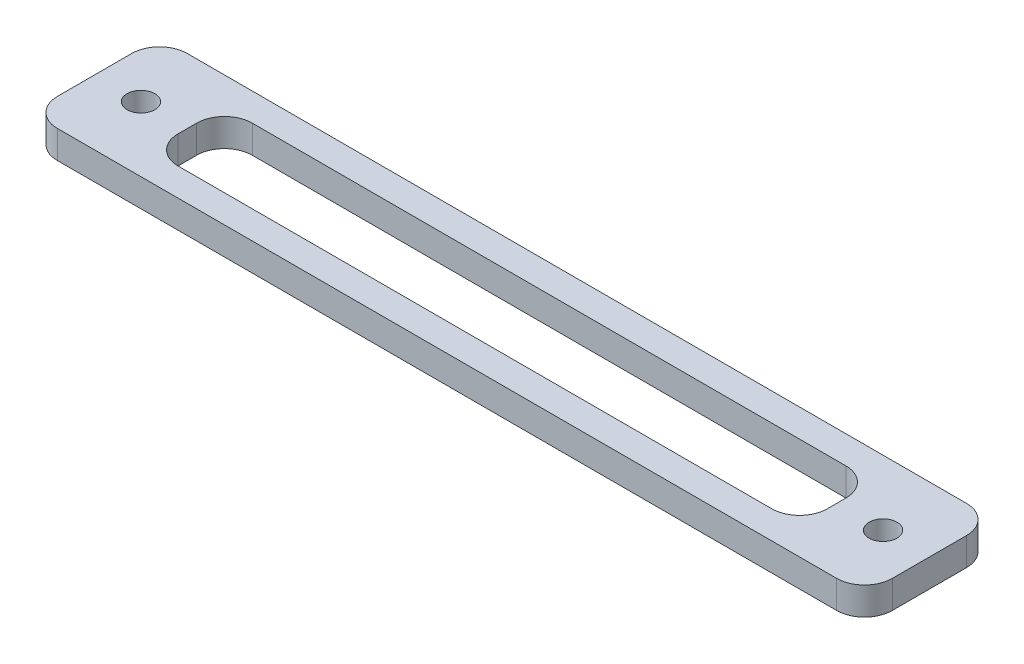
ISO-10303-21;
HEADER;
FILE_DESCRIPTION(('STEP AP214'),'2;1');
FILE_NAME('part.step','',(''),(''),'','','');
FILE_SCHEMA(('AUTOMOTIVE_DESIGN { 1 0 10303 214 1 1 1 1 }'));
ENDSEC;
DATA;
#1=APPLICATION_CONTEXT('core data for automotive mechanical design processes');
#2=APPLICATION_PROTOCOL_DEFINITION('international standard','automotive_design',2000,#1);
#3=PRODUCT_CONTEXT('',#1,'mechanical');
#4=PRODUCT('Part','Part','',(#3));
#5=PRODUCT_RELATED_PRODUCT_CATEGORY('part','',(#4));
#6=PRODUCT_DEFINITION_FORMATION('','',#4);
#7=PRODUCT_DEFINITION_CONTEXT('part definition',#1,'design');
#8=PRODUCT_DEFINITION('design','',#6,#7);
#9=PRODUCT_DEFINITION_SHAPE('','',#8);
#10=(LENGTH_UNIT() NAMED_UNIT(*) SI_UNIT(.MILLI.,.METRE.));
#11=(NAMED_UNIT(*) PLANE_ANGLE_UNIT() SI_UNIT($,.RADIAN.));
#12=(NAMED_UNIT(*) SI_UNIT($,.STERADIAN.) SOLID_ANGLE_UNIT());
#13=UNCERTAINTY_MEASURE_WITH_UNIT(LENGTH_MEASURE(1.E-05),#10,'distance_accuracy_value','');
#14=(GEOMETRIC_REPRESENTATION_CONTEXT(3) GLOBAL_UNCERTAINTY_ASSIGNED_CONTEXT((#13)) GLOBAL_UNIT_ASSIGNED_CONTEXT((#10,
#11,#12)) REPRESENTATION_CONTEXT('',''));
#15=CARTESIAN_POINT('',(0.,0.,0.));
#16=DIRECTION('',(0.,0.,1.));
#17=DIRECTION('',(1.,0.,0.));
#18=AXIS2_PLACEMENT_3D('',#15,#16,#17);
#19=CARTESIAN_POINT('',(0.,3.,0.));
#20=DIRECTION('',(0.,-1.,0.));
#21=DIRECTION('',(0.,0.,-1.));
#22=AXIS2_PLACEMENT_3D('',#19,#20,#21);
#23=PLANE('',#22);
#24=DIRECTION('',(0.,0.,1.));
#25=VECTOR('',#24,1.);
#26=CARTESIAN_POINT('',(-45.,3.,7.));
#27=LINE('',#26,#25);
#28=CARTESIAN_POINT('',(-45.,3.,-4.));
#29=VERTEX_POINT('',#28);
#30=CARTESIAN_POINT('',(-45.,3.,4.));
#31=VERTEX_POINT('',#30);
#32=EDGE_CURVE('E194',#29,#31,#27,.T.);
#33=ORIENTED_EDGE('',*,*,#32,.T.);
#34=CARTESIAN_POINT('',(-42.,3.,4.));
#35=DIRECTION('',(0.,-1.,0.));
#36=DIRECTION('',(0.,0.,-1.));
#37=AXIS2_PLACEMENT_3D('',#34,#35,#36);
#38=CIRCLE('',#37,3.);
#39=CARTESIAN_POINT('',(-42.,3.,7.));
#40=VERTEX_POINT('',#39);
#41=EDGE_CURVE('E253',#31,#40,#38,.F.);
#42=ORIENTED_EDGE('',*,*,#41,.T.);
#43=DIRECTION('',(1.,0.,0.));
#44=VECTOR('',#43,1.);
#45=CARTESIAN_POINT('',(-45.,3.,7.));
#46=LINE('',#45,#44);
#47=CARTESIAN_POINT('',(42.,3.,7.));
#48=VERTEX_POINT('',#47);
#49=EDGE_CURVE('E187',#40,#48,#46,.T.);
#50=ORIENTED_EDGE('',*,*,#49,.T.);
#51=CARTESIAN_POINT('',(42.,3.,4.));
#52=DIRECTION('',(0.,-1.,0.));
#53=DIRECTION('',(0.,0.,-1.));
#54=AXIS2_PLACEMENT_3D('',#51,#52,#53);
#55=CIRCLE('',#54,3.);
#56=CARTESIAN_POINT('',(45.,3.,4.));
#57=VERTEX_POINT('',#56);
#58=EDGE_CURVE('E247',#48,#57,#55,.F.);
#59=ORIENTED_EDGE('',*,*,#58,.T.);
#60=DIRECTION('',(0.,0.,-1.));
#61=VECTOR('',#60,1.);
#62=CARTESIAN_POINT('',(45.,3.,7.));
#63=LINE('',#62,#61);
#64=CARTESIAN_POINT('',(45.,3.,-4.));
#65=VERTEX_POINT('',#64);
#66=EDGE_CURVE('E327',#57,#65,#63,.T.);
#67=ORIENTED_EDGE('',*,*,#66,.T.);
#68=CARTESIAN_POINT('',(42.,3.,-4.));
#69=DIRECTION('',(0.,-1.,0.));
#70=DIRECTION('',(0.,0.,-1.));
#71=AXIS2_PLACEMENT_3D('',#68,#69,#70);
#72=CIRCLE('',#71,3.);
#73=CARTESIAN_POINT('',(42.,3.,-7.));
#74=VERTEX_POINT('',#73);
#75=EDGE_CURVE('E66',#65,#74,#72,.F.);
#76=ORIENTED_EDGE('',*,*,#75,.T.);
#77=DIRECTION('',(-1.,0.,0.));
#78=VECTOR('',#77,1.);
#79=CARTESIAN_POINT('',(-45.,3.,-7.));
#80=LINE('',#79,#78);
#81=CARTESIAN_POINT('',(-42.,3.,-7.));
#82=VERTEX_POINT('',#81);
#83=EDGE_CURVE('E330',#74,#82,#80,.T.);
#84=ORIENTED_EDGE('',*,*,#83,.T.);
#85=CARTESIAN_POINT('',(-42.,3.,-4.));
#86=DIRECTION('',(0.,-1.,0.));
#87=DIRECTION('',(0.,0.,-1.));
#88=AXIS2_PLACEMENT_3D('',#85,#86,#87);
#89=CIRCLE('',#88,3.);
#90=EDGE_CURVE('E250',#82,#29,#89,.F.);
#91=ORIENTED_EDGE('',*,*,#90,.T.);
#92=EDGE_LOOP('',(#33,#42,#50,#59,#67,#76,#84,#91));
#93=FACE_BOUND('',#92,.T.);
#94=DIRECTION('',(0.,0.,-1.));
#95=VECTOR('',#94,1.);
#96=CARTESIAN_POINT('',(35.,3.,3.99999999999999));
#97=LINE('',#96,#95);
#98=CARTESIAN_POINT('',(35.,3.,0.999999999999995));
#99=VERTEX_POINT('',#98);
#100=CARTESIAN_POINT('',(35.,3.,-1.00000000000001));
#101=VERTEX_POINT('',#100);
#102=EDGE_CURVE('E182',#99,#101,#97,.T.);
#103=ORIENTED_EDGE('',*,*,#102,.F.);
#104=CARTESIAN_POINT('',(32.,3.,0.999999999999995));
#105=DIRECTION('',(0.,-1.,0.));
#106=DIRECTION('',(0.,0.,-1.));
#107=AXIS2_PLACEMENT_3D('',#104,#105,#106);
#108=CIRCLE('',#107,3.);
#109=CARTESIAN_POINT('',(32.,3.,3.99999999999999));
#110=VERTEX_POINT('',#109);
#111=EDGE_CURVE('E272',#99,#110,#108,.T.);
#112=ORIENTED_EDGE('',*,*,#111,.T.);
#113=DIRECTION('',(1.,0.,0.));
#114=VECTOR('',#113,1.);
#115=CARTESIAN_POINT('',(-35.,3.,3.99999999999999));
#116=LINE('',#115,#114);
#117=CARTESIAN_POINT('',(-32.,3.,3.99999999999999));
#118=VERTEX_POINT('',#117);
#119=EDGE_CURVE('E311',#118,#110,#116,.T.);
#120=ORIENTED_EDGE('',*,*,#119,.F.);
#121=CARTESIAN_POINT('',(-32.,3.,0.999999999999995));
#122=DIRECTION('',(0.,-1.,0.));
#123=DIRECTION('',(0.,0.,-1.));
#124=AXIS2_PLACEMENT_3D('',#121,#122,#123);
#125=CIRCLE('',#124,3.);
#126=CARTESIAN_POINT('',(-35.,3.,0.999999999999995));
#127=VERTEX_POINT('',#126);
#128=EDGE_CURVE('E170',#118,#127,#125,.T.);
#129=ORIENTED_EDGE('',*,*,#128,.T.);
#130=DIRECTION('',(0.,0.,1.));
#131=VECTOR('',#130,1.);
#132=CARTESIAN_POINT('',(-35.,3.,3.99999999999999));
#133=LINE('',#132,#131);
#134=CARTESIAN_POINT('',(-35.,3.,-1.00000000000001));
#135=VERTEX_POINT('',#134);
#136=EDGE_CURVE('E303',#135,#127,#133,.T.);
#137=ORIENTED_EDGE('',*,*,#136,.F.);
#138=CARTESIAN_POINT('',(-32.,3.,-1.00000000000001));
#139=DIRECTION('',(0.,-1.,0.));
#140=DIRECTION('',(0.,0.,-1.));
#141=AXIS2_PLACEMENT_3D('',#138,#139,#140);
#142=CIRCLE('',#141,3.);
#143=CARTESIAN_POINT('',(-32.,3.,-4.00000000000001));
#144=VERTEX_POINT('',#143);
#145=EDGE_CURVE('E11',#135,#144,#142,.T.);
#146=ORIENTED_EDGE('',*,*,#145,.T.);
#147=DIRECTION('',(-1.,0.,0.));
#148=VECTOR('',#147,1.);
#149=CARTESIAN_POINT('',(-35.,3.,-4.00000000000001));
#150=LINE('',#149,#148);
#151=CARTESIAN_POINT('',(32.,3.,-4.00000000000001));
#152=VERTEX_POINT('',#151);
#153=EDGE_CURVE('E301',#152,#144,#150,.T.);
#154=ORIENTED_EDGE('',*,*,#153,.F.);
#155=CARTESIAN_POINT('',(32.,3.,-1.00000000000001));
#156=DIRECTION('',(0.,-1.,0.));
#157=DIRECTION('',(0.,0.,-1.));
#158=AXIS2_PLACEMENT_3D('',#155,#156,#157);
#159=CIRCLE('',#158,3.);
#160=EDGE_CURVE('E171',#152,#101,#159,.T.);
#161=ORIENTED_EDGE('',*,*,#160,.T.);
#162=EDGE_LOOP('',(#103,#112,#120,#129,#137,#146,#154,#161));
#163=FACE_BOUND('',#162,.T.);
#164=CARTESIAN_POINT('',(-40.,3.,0.));
#165=DIRECTION('',(0.,1.,0.));
#166=DIRECTION('',(0.,0.,1.));
#167=AXIS2_PLACEMENT_3D('',#164,#165,#166);
#168=CIRCLE('',#167,1.5);
#169=CARTESIAN_POINT('',(-40.,3.,1.5));
#170=VERTEX_POINT('',#169);
#171=EDGE_CURVE('E324',#170,#170,#168,.T.);
#172=ORIENTED_EDGE('',*,*,#171,.F.);
#173=EDGE_LOOP('',(#172));
#174=FACE_BOUND('',#173,.T.);
#175=CARTESIAN_POINT('',(40.,3.,0.));
#176=DIRECTION('',(0.,1.,0.));
#177=DIRECTION('',(0.,0.,-1.));
#178=AXIS2_PLACEMENT_3D('',#175,#176,#177);
#179=CIRCLE('',#178,1.5);
#180=CARTESIAN_POINT('',(40.,3.,-1.50000000000001));
#181=VERTEX_POINT('',#180);
#182=EDGE_CURVE('E598',#181,#181,#179,.T.);
#183=ORIENTED_EDGE('',*,*,#182,.F.);
#184=EDGE_LOOP('',(#183));
#185=FACE_BOUND('',#184,.T.);
#186=ADVANCED_FACE('F43',(#93,#163,#174,#185),#23,.F.);
#187=CARTESIAN_POINT('',(0.,0.,0.));
#188=DIRECTION('',(0.,-1.,0.));
#189=DIRECTION('',(0.,0.,-1.));
#190=AXIS2_PLACEMENT_3D('',#187,#188,#189);
#191=PLANE('',#190);
#192=CARTESIAN_POINT('',(-40.,0.,0.));
#193=DIRECTION('',(0.,1.,0.));
#194=DIRECTION('',(0.,0.,1.));
#195=AXIS2_PLACEMENT_3D('',#192,#193,#194);
#196=CIRCLE('',#195,1.5);
#197=CARTESIAN_POINT('',(-40.,0.,1.5));
#198=VERTEX_POINT('',#197);
#199=EDGE_CURVE('E596',#198,#198,#196,.T.);
#200=ORIENTED_EDGE('',*,*,#199,.T.);
#201=EDGE_LOOP('',(#200));
#202=FACE_BOUND('',#201,.T.);
#203=DIRECTION('',(1.,0.,0.));
#204=VECTOR('',#203,1.);
#205=CARTESIAN_POINT('',(-45.,0.,7.));
#206=LINE('',#205,#204);
#207=CARTESIAN_POINT('',(-42.,0.,7.));
#208=VERTEX_POINT('',#207);
#209=CARTESIAN_POINT('',(42.,0.,7.));
#210=VERTEX_POINT('',#209);
#211=EDGE_CURVE('E197',#208,#210,#206,.T.);
#212=ORIENTED_EDGE('',*,*,#211,.F.);
#213=CARTESIAN_POINT('',(-42.,0.,4.));
#214=DIRECTION('',(0.,-1.,0.));
#215=DIRECTION('',(0.,0.,-1.));
#216=AXIS2_PLACEMENT_3D('',#213,#214,#215);
#217=CIRCLE('',#216,3.);
#218=CARTESIAN_POINT('',(-45.,0.,4.));
#219=VERTEX_POINT('',#218);
#220=EDGE_CURVE('E235',#208,#219,#217,.T.);
#221=ORIENTED_EDGE('',*,*,#220,.T.);
#222=DIRECTION('',(0.,0.,1.));
#223=VECTOR('',#222,1.);
#224=CARTESIAN_POINT('',(-45.,0.,7.));
#225=LINE('',#224,#223);
#226=CARTESIAN_POINT('',(-45.,0.,-4.));
#227=VERTEX_POINT('',#226);
#228=EDGE_CURVE('E341',#227,#219,#225,.T.);
#229=ORIENTED_EDGE('',*,*,#228,.F.);
#230=CARTESIAN_POINT('',(-42.,0.,-4.));
#231=DIRECTION('',(0.,-1.,0.));
#232=DIRECTION('',(0.,0.,-1.));
#233=AXIS2_PLACEMENT_3D('',#230,#231,#232);
#234=CIRCLE('',#233,3.);
#235=CARTESIAN_POINT('',(-42.,0.,-7.));
#236=VERTEX_POINT('',#235);
#237=EDGE_CURVE('E232',#227,#236,#234,.T.);
#238=ORIENTED_EDGE('',*,*,#237,.T.);
#239=DIRECTION('',(-1.,0.,0.));
#240=VECTOR('',#239,1.);
#241=CARTESIAN_POINT('',(-45.,0.,-7.));
#242=LINE('',#241,#240);
#243=CARTESIAN_POINT('',(42.,0.,-7.));
#244=VERTEX_POINT('',#243);
#245=EDGE_CURVE('E339',#244,#236,#242,.T.);
#246=ORIENTED_EDGE('',*,*,#245,.F.);
#247=CARTESIAN_POINT('',(42.,0.,-4.));
#248=DIRECTION('',(0.,-1.,0.));
#249=DIRECTION('',(0.,0.,-1.));
#250=AXIS2_PLACEMENT_3D('',#247,#248,#249);
#251=CIRCLE('',#250,3.);
#252=CARTESIAN_POINT('',(45.,0.,-4.));
#253=VERTEX_POINT('',#252);
#254=EDGE_CURVE('E226',#244,#253,#251,.T.);
#255=ORIENTED_EDGE('',*,*,#254,.T.);
#256=DIRECTION('',(0.,0.,-1.));
#257=VECTOR('',#256,1.);
#258=CARTESIAN_POINT('',(45.,0.,7.));
#259=LINE('',#258,#257);
#260=CARTESIAN_POINT('',(45.,0.,4.));
#261=VERTEX_POINT('',#260);
#262=EDGE_CURVE('E319',#261,#253,#259,.T.);
#263=ORIENTED_EDGE('',*,*,#262,.F.);
#264=CARTESIAN_POINT('',(42.,0.,4.));
#265=DIRECTION('',(0.,-1.,0.));
#266=DIRECTION('',(0.,0.,-1.));
#267=AXIS2_PLACEMENT_3D('',#264,#265,#266);
#268=CIRCLE('',#267,3.);
#269=EDGE_CURVE('E229',#261,#210,#268,.T.);
#270=ORIENTED_EDGE('',*,*,#269,.T.);
#271=EDGE_LOOP('',(#212,#221,#229,#238,#246,#255,#263,#270));
#272=FACE_BOUND('',#271,.T.);
#273=DIRECTION('',(0.,0.,1.));
#274=VECTOR('',#273,1.);
#275=CARTESIAN_POINT('',(-35.,0.,3.99999999999999));
#276=LINE('',#275,#274);
#277=CARTESIAN_POINT('',(-35.,0.,-1.00000000000001));
#278=VERTEX_POINT('',#277);
#279=CARTESIAN_POINT('',(-35.,0.,0.999999999999995));
#280=VERTEX_POINT('',#279);
#281=EDGE_CURVE('E164',#278,#280,#276,.T.);
#282=ORIENTED_EDGE('',*,*,#281,.T.);
#283=CARTESIAN_POINT('',(-32.,0.,0.999999999999995));
#284=DIRECTION('',(0.,-1.,0.));
#285=DIRECTION('',(0.,0.,-1.));
#286=AXIS2_PLACEMENT_3D('',#283,#284,#285);
#287=CIRCLE('',#286,3.);
#288=CARTESIAN_POINT('',(-32.,0.,3.99999999999999));
#289=VERTEX_POINT('',#288);
#290=EDGE_CURVE('E158',#280,#289,#287,.F.);
#291=ORIENTED_EDGE('',*,*,#290,.T.);
#292=DIRECTION('',(1.,0.,0.));
#293=VECTOR('',#292,1.);
#294=CARTESIAN_POINT('',(-35.,0.,3.99999999999999));
#295=LINE('',#294,#293);
#296=CARTESIAN_POINT('',(32.,0.,3.99999999999999));
#297=VERTEX_POINT('',#296);
#298=EDGE_CURVE('E162',#289,#297,#295,.T.);
#299=ORIENTED_EDGE('',*,*,#298,.T.);
#300=CARTESIAN_POINT('',(32.,0.,0.999999999999995));
#301=DIRECTION('',(0.,-1.,0.));
#302=DIRECTION('',(0.,0.,-1.));
#303=AXIS2_PLACEMENT_3D('',#300,#301,#302);
#304=CIRCLE('',#303,3.);
#305=CARTESIAN_POINT('',(35.,0.,0.999999999999995));
#306=VERTEX_POINT('',#305);
#307=EDGE_CURVE('E269',#297,#306,#304,.F.);
#308=ORIENTED_EDGE('',*,*,#307,.T.);
#309=DIRECTION('',(0.,0.,-1.));
#310=VECTOR('',#309,1.);
#311=CARTESIAN_POINT('',(35.,0.,3.99999999999999));
#312=LINE('',#311,#310);
#313=CARTESIAN_POINT('',(35.,0.,-1.00000000000001));
#314=VERTEX_POINT('',#313);
#315=EDGE_CURVE('E320',#306,#314,#312,.T.);
#316=ORIENTED_EDGE('',*,*,#315,.T.);
#317=CARTESIAN_POINT('',(32.,0.,-1.00000000000001));
#318=DIRECTION('',(0.,-1.,0.));
#319=DIRECTION('',(0.,0.,-1.));
#320=AXIS2_PLACEMENT_3D('',#317,#318,#319);
#321=CIRCLE('',#320,3.);
#322=CARTESIAN_POINT('',(32.,0.,-4.00000000000001));
#323=VERTEX_POINT('',#322);
#324=EDGE_CURVE('E275',#314,#323,#321,.F.);
#325=ORIENTED_EDGE('',*,*,#324,.T.);
#326=DIRECTION('',(-1.,0.,0.));
#327=VECTOR('',#326,1.);
#328=CARTESIAN_POINT('',(-35.,0.,-4.00000000000001));
#329=LINE('',#328,#327);
#330=CARTESIAN_POINT('',(-32.,0.,-4.00000000000001));
#331=VERTEX_POINT('',#330);
#332=EDGE_CURVE('E284',#323,#331,#329,.T.);
#333=ORIENTED_EDGE('',*,*,#332,.T.);
#334=CARTESIAN_POINT('',(-32.,0.,-1.00000000000001));
#335=DIRECTION('',(0.,-1.,0.));
#336=DIRECTION('',(0.,0.,-1.));
#337=AXIS2_PLACEMENT_3D('',#334,#335,#336);
#338=CIRCLE('',#337,3.);
#339=EDGE_CURVE('E52',#331,#278,#338,.F.);
#340=ORIENTED_EDGE('',*,*,#339,.T.);
#341=EDGE_LOOP('',(#282,#291,#299,#308,#316,#325,#333,#340));
#342=FACE_BOUND('',#341,.T.);
#343=CARTESIAN_POINT('',(40.,0.,0.));
#344=DIRECTION('',(0.,1.,0.));
#345=DIRECTION('',(0.,0.,-1.));
#346=AXIS2_PLACEMENT_3D('',#343,#344,#345);
#347=CIRCLE('',#346,1.5);
#348=CARTESIAN_POINT('',(40.,0.,-1.50000000000001));
#349=VERTEX_POINT('',#348);
#350=EDGE_CURVE('E603',#349,#349,#347,.T.);
#351=ORIENTED_EDGE('',*,*,#350,.T.);
#352=EDGE_LOOP('',(#351));
#353=FACE_BOUND('',#352,.T.);
#354=ADVANCED_FACE('F160',(#202,#272,#342,#353),#191,.T.);
#355=CARTESIAN_POINT('',(45.,3.,7.));
#356=DIRECTION('',(-1.,0.,0.));
#357=DIRECTION('',(0.,0.,1.));
#358=AXIS2_PLACEMENT_3D('',#355,#356,#357);
#359=PLANE('',#358);
#360=ORIENTED_EDGE('',*,*,#66,.F.);
#361=DIRECTION('',(0.,-1.,0.));
#362=VECTOR('',#361,1.);
#363=CARTESIAN_POINT('',(45.,3.,4.));
#364=LINE('',#363,#362);
#365=EDGE_CURVE('E265',#57,#261,#364,.T.);
#366=ORIENTED_EDGE('',*,*,#365,.T.);
#367=ORIENTED_EDGE('',*,*,#262,.T.);
#368=DIRECTION('',(0.,-1.,0.));
#369=VECTOR('',#368,1.);
#370=CARTESIAN_POINT('',(45.,3.,-4.));
#371=LINE('',#370,#369);
#372=EDGE_CURVE('E262',#253,#65,#371,.F.);
#373=ORIENTED_EDGE('',*,*,#372,.T.);
#374=EDGE_LOOP('',(#360,#366,#367,#373));
#375=FACE_BOUND('',#374,.T.);
#376=ADVANCED_FACE('F362',(#375),#359,.F.);
#377=CARTESIAN_POINT('',(-45.,3.,-7.));
#378=DIRECTION('',(0.,0.,1.));
#379=DIRECTION('',(1.,0.,0.));
#380=AXIS2_PLACEMENT_3D('',#377,#378,#379);
#381=PLANE('',#380);
#382=ORIENTED_EDGE('',*,*,#245,.T.);
#383=DIRECTION('',(0.,-1.,0.));
#384=VECTOR('',#383,1.);
#385=CARTESIAN_POINT('',(-42.,3.,-7.));
#386=LINE('',#385,#384);
#387=EDGE_CURVE('E59',#236,#82,#386,.F.);
#388=ORIENTED_EDGE('',*,*,#387,.T.);
#389=ORIENTED_EDGE('',*,*,#83,.F.);
#390=DIRECTION('',(0.,-1.,0.));
#391=VECTOR('',#390,1.);
#392=CARTESIAN_POINT('',(42.,3.,-7.));
#393=LINE('',#392,#391);
#394=EDGE_CURVE('E256',#74,#244,#393,.T.);
#395=ORIENTED_EDGE('',*,*,#394,.T.);
#396=EDGE_LOOP('',(#382,#388,#389,#395));
#397=FACE_BOUND('',#396,.T.);
#398=ADVANCED_FACE('F368',(#397),#381,.F.);
#399=CARTESIAN_POINT('',(-45.,3.,7.));
#400=DIRECTION('',(1.,0.,0.));
#401=DIRECTION('',(0.,0.,-1.));
#402=AXIS2_PLACEMENT_3D('',#399,#400,#401);
#403=PLANE('',#402);
#404=ORIENTED_EDGE('',*,*,#228,.T.);
#405=DIRECTION('',(0.,-1.,0.));
#406=VECTOR('',#405,1.);
#407=CARTESIAN_POINT('',(-45.,3.,4.));
#408=LINE('',#407,#406);
#409=EDGE_CURVE('E242',#219,#31,#408,.F.);
#410=ORIENTED_EDGE('',*,*,#409,.T.);
#411=ORIENTED_EDGE('',*,*,#32,.F.);
#412=DIRECTION('',(0.,-1.,0.));
#413=VECTOR('',#412,1.);
#414=CARTESIAN_POINT('',(-45.,3.,-4.));
#415=LINE('',#414,#413);
#416=EDGE_CURVE('E238',#29,#227,#415,.T.);
#417=ORIENTED_EDGE('',*,*,#416,.T.);
#418=EDGE_LOOP('',(#404,#410,#411,#417));
#419=FACE_BOUND('',#418,.T.);
#420=ADVANCED_FACE('F374',(#419),#403,.F.);
#421=CARTESIAN_POINT('',(-45.,3.,7.));
#422=DIRECTION('',(0.,0.,-1.));
#423=DIRECTION('',(-1.,0.,0.));
#424=AXIS2_PLACEMENT_3D('',#421,#422,#423);
#425=PLANE('',#424);
#426=ORIENTED_EDGE('',*,*,#49,.F.);
#427=DIRECTION('',(0.,-1.,0.));
#428=VECTOR('',#427,1.);
#429=CARTESIAN_POINT('',(-42.,3.,7.));
#430=LINE('',#429,#428);
#431=EDGE_CURVE('E222',#40,#208,#430,.T.);
#432=ORIENTED_EDGE('',*,*,#431,.T.);
#433=ORIENTED_EDGE('',*,*,#211,.T.);
#434=DIRECTION('',(0.,-1.,0.));
#435=VECTOR('',#434,1.);
#436=CARTESIAN_POINT('',(42.,3.,7.));
#437=LINE('',#436,#435);
#438=EDGE_CURVE('E219',#210,#48,#437,.F.);
#439=ORIENTED_EDGE('',*,*,#438,.T.);
#440=EDGE_LOOP('',(#426,#432,#433,#439));
#441=FACE_BOUND('',#440,.T.);
#442=ADVANCED_FACE('F353',(#441),#425,.F.);
#443=CARTESIAN_POINT('',(35.,3.,3.99999999999999));
#444=DIRECTION('',(-1.,0.,0.));
#445=DIRECTION('',(0.,0.,1.));
#446=AXIS2_PLACEMENT_3D('',#443,#444,#445);
#447=PLANE('',#446);
#448=ORIENTED_EDGE('',*,*,#315,.F.);
#449=DIRECTION('',(0.,-1.,0.));
#450=VECTOR('',#449,1.);
#451=CARTESIAN_POINT('',(35.,3.,0.999999999999995));
#452=LINE('',#451,#450);
#453=EDGE_CURVE('E203',#306,#99,#452,.F.);
#454=ORIENTED_EDGE('',*,*,#453,.T.);
#455=ORIENTED_EDGE('',*,*,#102,.T.);
#456=DIRECTION('',(0.,-1.,0.));
#457=VECTOR('',#456,1.);
#458=CARTESIAN_POINT('',(35.,0.,-1.00000000000001));
#459=LINE('',#458,#457);
#460=EDGE_CURVE('E191',#101,#314,#459,.T.);
#461=ORIENTED_EDGE('',*,*,#460,.T.);
#462=EDGE_LOOP('',(#448,#454,#455,#461));
#463=FACE_BOUND('',#462,.T.);
#464=ADVANCED_FACE('F394',(#463),#447,.T.);
#465=CARTESIAN_POINT('',(-35.,3.,-4.00000000000001));
#466=DIRECTION('',(0.,0.,1.));
#467=DIRECTION('',(1.,0.,0.));
#468=AXIS2_PLACEMENT_3D('',#465,#466,#467);
#469=PLANE('',#468);
#470=ORIENTED_EDGE('',*,*,#332,.F.);
#471=DIRECTION('',(0.,-1.,0.));
#472=VECTOR('',#471,1.);
#473=CARTESIAN_POINT('',(32.,3.,-4.00000000000001));
#474=LINE('',#473,#472);
#475=EDGE_CURVE('E210',#323,#152,#474,.F.);
#476=ORIENTED_EDGE('',*,*,#475,.T.);
#477=ORIENTED_EDGE('',*,*,#153,.T.);
#478=DIRECTION('',(0.,-1.,0.));
#479=VECTOR('',#478,1.);
#480=CARTESIAN_POINT('',(-32.,0.,-4.00000000000001));
#481=LINE('',#480,#479);
#482=EDGE_CURVE('E206',#144,#331,#481,.T.);
#483=ORIENTED_EDGE('',*,*,#482,.T.);
#484=EDGE_LOOP('',(#470,#476,#477,#483));
#485=FACE_BOUND('',#484,.T.);
#486=ADVANCED_FACE('F305',(#485),#469,.T.);
#487=CARTESIAN_POINT('',(-35.,3.,3.99999999999999));
#488=DIRECTION('',(1.,0.,0.));
#489=DIRECTION('',(0.,0.,-1.));
#490=AXIS2_PLACEMENT_3D('',#487,#488,#489);
#491=PLANE('',#490);
#492=ORIENTED_EDGE('',*,*,#136,.T.);
#493=DIRECTION('',(0.,-1.,0.));
#494=VECTOR('',#493,1.);
#495=CARTESIAN_POINT('',(-35.,0.,0.999999999999995));
#496=LINE('',#495,#494);
#497=EDGE_CURVE('E216',#127,#280,#496,.T.);
#498=ORIENTED_EDGE('',*,*,#497,.T.);
#499=ORIENTED_EDGE('',*,*,#281,.F.);
#500=DIRECTION('',(0.,-1.,0.));
#501=VECTOR('',#500,1.);
#502=CARTESIAN_POINT('',(-35.,3.,-1.00000000000001));
#503=LINE('',#502,#501);
#504=EDGE_CURVE('E213',#278,#135,#503,.F.);
#505=ORIENTED_EDGE('',*,*,#504,.T.);
#506=EDGE_LOOP('',(#492,#498,#499,#505));
#507=FACE_BOUND('',#506,.T.);
#508=ADVANCED_FACE('F290',(#507),#491,.T.);
#509=CARTESIAN_POINT('',(-35.,3.,3.99999999999999));
#510=DIRECTION('',(0.,0.,-1.));
#511=DIRECTION('',(-1.,0.,0.));
#512=AXIS2_PLACEMENT_3D('',#509,#510,#511);
#513=PLANE('',#512);
#514=ORIENTED_EDGE('',*,*,#119,.T.);
#515=DIRECTION('',(0.,-1.,0.));
#516=VECTOR('',#515,1.);
#517=CARTESIAN_POINT('',(32.,0.,3.99999999999999));
#518=LINE('',#517,#516);
#519=EDGE_CURVE('E180',#110,#297,#518,.T.);
#520=ORIENTED_EDGE('',*,*,#519,.T.);
#521=ORIENTED_EDGE('',*,*,#298,.F.);
#522=DIRECTION('',(0.,-1.,0.));
#523=VECTOR('',#522,1.);
#524=CARTESIAN_POINT('',(-32.,3.,3.99999999999999));
#525=LINE('',#524,#523);
#526=EDGE_CURVE('E177',#289,#118,#525,.F.);
#527=ORIENTED_EDGE('',*,*,#526,.T.);
#528=EDGE_LOOP('',(#514,#520,#521,#527));
#529=FACE_BOUND('',#528,.T.);
#530=ADVANCED_FACE('F176',(#529),#513,.T.);
#531=CARTESIAN_POINT('',(-40.,3.,0.));
#532=DIRECTION('',(0.,-1.,0.));
#533=DIRECTION('',(0.,0.,-1.));
#534=AXIS2_PLACEMENT_3D('',#531,#532,#533);
#535=CYLINDRICAL_SURFACE('',#534,1.5);
#536=ORIENTED_EDGE('',*,*,#171,.T.);
#537=EDGE_LOOP('',(#536));
#538=FACE_BOUND('',#537,.T.);
#539=ORIENTED_EDGE('',*,*,#199,.F.);
#540=EDGE_LOOP('',(#539));
#541=FACE_BOUND('',#540,.T.);
#542=ADVANCED_FACE('F481',(#538,#541),#535,.F.);
#543=CARTESIAN_POINT('',(40.,3.,0.));
#544=DIRECTION('',(0.,-1.,0.));
#545=DIRECTION('',(0.,0.,-1.));
#546=AXIS2_PLACEMENT_3D('',#543,#544,#545);
#547=CYLINDRICAL_SURFACE('',#546,1.5);
#548=ORIENTED_EDGE('',*,*,#182,.T.);
#549=EDGE_LOOP('',(#548));
#550=FACE_BOUND('',#549,.T.);
#551=ORIENTED_EDGE('',*,*,#350,.F.);
#552=EDGE_LOOP('',(#551));
#553=FACE_BOUND('',#552,.T.);
#554=ADVANCED_FACE('F409',(#550,#553),#547,.F.);
#555=CARTESIAN_POINT('',(32.,3.,0.999999999999995));
#556=DIRECTION('',(0.,1.,0.));
#557=DIRECTION('',(0.,0.,1.));
#558=AXIS2_PLACEMENT_3D('',#555,#556,#557);
#559=CYLINDRICAL_SURFACE('',#558,3.);
#560=ORIENTED_EDGE('',*,*,#111,.F.);
#561=ORIENTED_EDGE('',*,*,#453,.F.);
#562=ORIENTED_EDGE('',*,*,#307,.F.);
#563=ORIENTED_EDGE('',*,*,#519,.F.);
#564=EDGE_LOOP('',(#560,#561,#562,#563));
#565=FACE_BOUND('',#564,.T.);
#566=ADVANCED_FACE('F405',(#565),#559,.F.);
#567=CARTESIAN_POINT('',(32.,3.,-1.00000000000001));
#568=DIRECTION('',(0.,1.,0.));
#569=DIRECTION('',(0.,0.,1.));
#570=AXIS2_PLACEMENT_3D('',#567,#568,#569);
#571=CYLINDRICAL_SURFACE('',#570,3.);
#572=ORIENTED_EDGE('',*,*,#160,.F.);
#573=ORIENTED_EDGE('',*,*,#475,.F.);
#574=ORIENTED_EDGE('',*,*,#324,.F.);
#575=ORIENTED_EDGE('',*,*,#460,.F.);
#576=EDGE_LOOP('',(#572,#573,#574,#575));
#577=FACE_BOUND('',#576,.T.);
#578=ADVANCED_FACE('F408',(#577),#571,.F.);
#579=CARTESIAN_POINT('',(-32.,3.,0.999999999999995));
#580=DIRECTION('',(0.,1.,0.));
#581=DIRECTION('',(0.,0.,1.));
#582=AXIS2_PLACEMENT_3D('',#579,#580,#581);
#583=CYLINDRICAL_SURFACE('',#582,3.);
#584=ORIENTED_EDGE('',*,*,#128,.F.);
#585=ORIENTED_EDGE('',*,*,#526,.F.);
#586=ORIENTED_EDGE('',*,*,#290,.F.);
#587=ORIENTED_EDGE('',*,*,#497,.F.);
#588=EDGE_LOOP('',(#584,#585,#586,#587));
#589=FACE_BOUND('',#588,.T.);
#590=ADVANCED_FACE('F185',(#589),#583,.F.);
#591=CARTESIAN_POINT('',(-32.,3.,-1.00000000000001));
#592=DIRECTION('',(0.,1.,0.));
#593=DIRECTION('',(0.,0.,1.));
#594=AXIS2_PLACEMENT_3D('',#591,#592,#593);
#595=CYLINDRICAL_SURFACE('',#594,3.);
#596=ORIENTED_EDGE('',*,*,#145,.F.);
#597=ORIENTED_EDGE('',*,*,#504,.F.);
#598=ORIENTED_EDGE('',*,*,#339,.F.);
#599=ORIENTED_EDGE('',*,*,#482,.F.);
#600=EDGE_LOOP('',(#596,#597,#598,#599));
#601=FACE_BOUND('',#600,.T.);
#602=ADVANCED_FACE('F295',(#601),#595,.F.);
#603=CARTESIAN_POINT('',(-42.,3.,4.));
#604=DIRECTION('',(0.,-1.,0.));
#605=DIRECTION('',(0.,0.,-1.));
#606=AXIS2_PLACEMENT_3D('',#603,#604,#605);
#607=CYLINDRICAL_SURFACE('',#606,3.);
#608=ORIENTED_EDGE('',*,*,#41,.F.);
#609=ORIENTED_EDGE('',*,*,#409,.F.);
#610=ORIENTED_EDGE('',*,*,#220,.F.);
#611=ORIENTED_EDGE('',*,*,#431,.F.);
#612=EDGE_LOOP('',(#608,#609,#610,#611));
#613=FACE_BOUND('',#612,.T.);
#614=ADVANCED_FACE('F377',(#613),#607,.T.);
#615=CARTESIAN_POINT('',(-42.,3.,-4.));
#616=DIRECTION('',(0.,-1.,0.));
#617=DIRECTION('',(0.,0.,-1.));
#618=AXIS2_PLACEMENT_3D('',#615,#616,#617);
#619=CYLINDRICAL_SURFACE('',#618,3.);
#620=ORIENTED_EDGE('',*,*,#90,.F.);
#621=ORIENTED_EDGE('',*,*,#387,.F.);
#622=ORIENTED_EDGE('',*,*,#237,.F.);
#623=ORIENTED_EDGE('',*,*,#416,.F.);
#624=EDGE_LOOP('',(#620,#621,#622,#623));
#625=FACE_BOUND('',#624,.T.);
#626=ADVANCED_FACE('F372',(#625),#619,.T.);
#627=CARTESIAN_POINT('',(42.,3.,4.));
#628=DIRECTION('',(0.,-1.,0.));
#629=DIRECTION('',(0.,0.,-1.));
#630=AXIS2_PLACEMENT_3D('',#627,#628,#629);
#631=CYLINDRICAL_SURFACE('',#630,3.);
#632=ORIENTED_EDGE('',*,*,#58,.F.);
#633=ORIENTED_EDGE('',*,*,#438,.F.);
#634=ORIENTED_EDGE('',*,*,#269,.F.);
#635=ORIENTED_EDGE('',*,*,#365,.F.);
#636=EDGE_LOOP('',(#632,#633,#634,#635));
#637=FACE_BOUND('',#636,.T.);
#638=ADVANCED_FACE('F358',(#637),#631,.T.);
#639=CARTESIAN_POINT('',(42.,3.,-4.));
#640=DIRECTION('',(0.,-1.,0.));
#641=DIRECTION('',(0.,0.,-1.));
#642=AXIS2_PLACEMENT_3D('',#639,#640,#641);
#643=CYLINDRICAL_SURFACE('',#642,3.);
#644=ORIENTED_EDGE('',*,*,#75,.F.);
#645=ORIENTED_EDGE('',*,*,#372,.F.);
#646=ORIENTED_EDGE('',*,*,#254,.F.);
#647=ORIENTED_EDGE('',*,*,#394,.F.);
#648=EDGE_LOOP('',(#644,#645,#646,#647));
#649=FACE_BOUND('',#648,.T.);
#650=ADVANCED_FACE('F45',(#649),#643,.T.);
#651=CLOSED_SHELL('',(#186,#354,#376,#398,#420,#442,#464,#486,#508,#530,#542,#554,#566,#578,
#590,#602,#614,#626,#638,#650));
#652=MANIFOLD_SOLID_BREP('B2',#651);
#653=ADVANCED_BREP_SHAPE_REPRESENTATION('',(#18,#652),#14);
#654=SHAPE_DEFINITION_REPRESENTATION(#9,#653);
ENDSEC;
END-ISO-10303-21;
